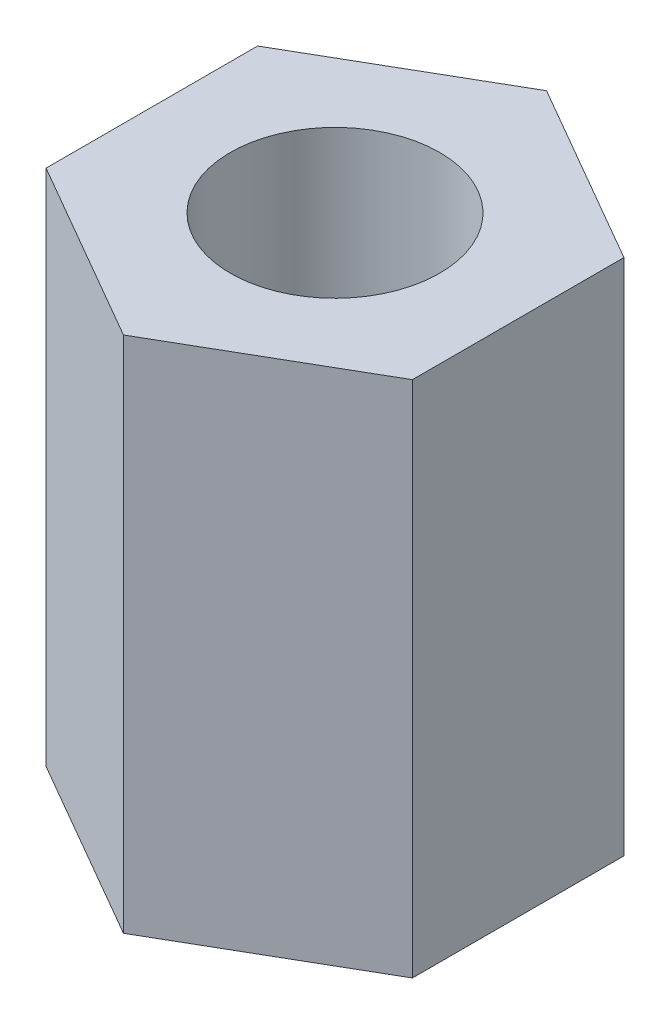
ISO-10303-21;
HEADER;
FILE_DESCRIPTION(('STEP AP214'),'2;1');
FILE_NAME('part.step','',(''),(''),'','','');
FILE_SCHEMA(('AUTOMOTIVE_DESIGN { 1 0 10303 214 1 1 1 1 }'));
ENDSEC;
DATA;
#1=APPLICATION_CONTEXT('core data for automotive mechanical design processes');
#2=APPLICATION_PROTOCOL_DEFINITION('international standard','automotive_design',2000,#1);
#3=PRODUCT_CONTEXT('',#1,'mechanical');
#4=PRODUCT('Part','Part','',(#3));
#5=PRODUCT_RELATED_PRODUCT_CATEGORY('part','',(#4));
#6=PRODUCT_DEFINITION_FORMATION('','',#4);
#7=PRODUCT_DEFINITION_CONTEXT('part definition',#1,'design');
#8=PRODUCT_DEFINITION('design','',#6,#7);
#9=PRODUCT_DEFINITION_SHAPE('','',#8);
#10=(LENGTH_UNIT() NAMED_UNIT(*) SI_UNIT(.MILLI.,.METRE.));
#11=(NAMED_UNIT(*) PLANE_ANGLE_UNIT() SI_UNIT($,.RADIAN.));
#12=(NAMED_UNIT(*) SI_UNIT($,.STERADIAN.) SOLID_ANGLE_UNIT());
#13=UNCERTAINTY_MEASURE_WITH_UNIT(LENGTH_MEASURE(1.E-05),#10,'distance_accuracy_value','');
#14=(GEOMETRIC_REPRESENTATION_CONTEXT(3) GLOBAL_UNCERTAINTY_ASSIGNED_CONTEXT((#13)) GLOBAL_UNIT_ASSIGNED_CONTEXT((#10,
#11,#12)) REPRESENTATION_CONTEXT('',''));
#15=CARTESIAN_POINT('',(0.,0.,0.));
#16=DIRECTION('',(0.,0.,1.));
#17=DIRECTION('',(1.,0.,0.));
#18=AXIS2_PLACEMENT_3D('',#15,#16,#17);
#19=CARTESIAN_POINT('',(0.,9.9,0.));
#20=DIRECTION('',(0.,1.,0.));
#21=DIRECTION('',(0.,0.,1.));
#22=AXIS2_PLACEMENT_3D('',#19,#20,#21);
#23=PLANE('',#22);
#24=DIRECTION('',(0.,0.,1.));
#25=VECTOR('',#24,1.);
#26=CARTESIAN_POINT('',(-3.5,9.9,-2.02072594216369));
#27=LINE('',#26,#25);
#28=CARTESIAN_POINT('',(-3.5,9.9,-2.02072594216369));
#29=VERTEX_POINT('',#28);
#30=CARTESIAN_POINT('',(-3.5,9.9,2.02072594216369));
#31=VERTEX_POINT('',#30);
#32=EDGE_CURVE('E152',#29,#31,#27,.T.);
#33=ORIENTED_EDGE('',*,*,#32,.T.);
#34=DIRECTION('',(0.866025403784439,0.,0.5));
#35=VECTOR('',#34,1.);
#36=CARTESIAN_POINT('',(-3.5,9.9,2.02072594216369));
#37=LINE('',#36,#35);
#38=CARTESIAN_POINT('',(0.,9.9,4.04145188432738));
#39=VERTEX_POINT('',#38);
#40=EDGE_CURVE('E100',#31,#39,#37,.T.);
#41=ORIENTED_EDGE('',*,*,#40,.T.);
#42=DIRECTION('',(0.866025403784439,0.,-0.5));
#43=VECTOR('',#42,1.);
#44=CARTESIAN_POINT('',(0.,9.9,4.04145188432738));
#45=LINE('',#44,#43);
#46=CARTESIAN_POINT('',(3.5,9.9,2.02072594216369));
#47=VERTEX_POINT('',#46);
#48=EDGE_CURVE('E113',#39,#47,#45,.T.);
#49=ORIENTED_EDGE('',*,*,#48,.T.);
#50=DIRECTION('',(0.,0.,-1.));
#51=VECTOR('',#50,1.);
#52=CARTESIAN_POINT('',(3.5,9.9,2.02072594216369));
#53=LINE('',#52,#51);
#54=CARTESIAN_POINT('',(3.5,9.9,-2.02072594216369));
#55=VERTEX_POINT('',#54);
#56=EDGE_CURVE('E107',#47,#55,#53,.T.);
#57=ORIENTED_EDGE('',*,*,#56,.T.);
#58=DIRECTION('',(-0.866025403784439,0.,-0.5));
#59=VECTOR('',#58,1.);
#60=CARTESIAN_POINT('',(3.5,9.9,-2.02072594216369));
#61=LINE('',#60,#59);
#62=CARTESIAN_POINT('',(0.,9.9,-4.04145188432738));
#63=VERTEX_POINT('',#62);
#64=EDGE_CURVE('E111',#55,#63,#61,.T.);
#65=ORIENTED_EDGE('',*,*,#64,.T.);
#66=DIRECTION('',(-0.866025403784438,0.,0.5));
#67=VECTOR('',#66,1.);
#68=CARTESIAN_POINT('',(0.,9.9,-4.04145188432738));
#69=LINE('',#68,#67);
#70=EDGE_CURVE('E63',#63,#29,#69,.T.);
#71=ORIENTED_EDGE('',*,*,#70,.T.);
#72=EDGE_LOOP('',(#33,#41,#49,#57,#65,#71));
#73=FACE_BOUND('',#72,.T.);
#74=CARTESIAN_POINT('',(0.,9.9,0.));
#75=DIRECTION('',(0.,1.,0.));
#76=DIRECTION('',(0.,0.,1.));
#77=AXIS2_PLACEMENT_3D('',#74,#75,#76);
#78=CIRCLE('',#77,2.);
#79=CARTESIAN_POINT('',(0.,9.9,-2.));
#80=VERTEX_POINT('',#79);
#81=EDGE_CURVE('E140',#80,#80,#78,.T.);
#82=ORIENTED_EDGE('',*,*,#81,.F.);
#83=EDGE_LOOP('',(#82));
#84=FACE_BOUND('',#83,.T.);
#85=ADVANCED_FACE('F45',(#73,#84),#23,.T.);
#86=CARTESIAN_POINT('',(0.,0.,0.));
#87=DIRECTION('',(0.,1.,0.));
#88=DIRECTION('',(0.,0.,1.));
#89=AXIS2_PLACEMENT_3D('',#86,#87,#88);
#90=PLANE('',#89);
#91=DIRECTION('',(0.,0.,1.));
#92=VECTOR('',#91,1.);
#93=CARTESIAN_POINT('',(-3.5,0.,-2.02072594216369));
#94=LINE('',#93,#92);
#95=CARTESIAN_POINT('',(-3.5,0.,-2.02072594216369));
#96=VERTEX_POINT('',#95);
#97=CARTESIAN_POINT('',(-3.5,0.,2.02072594216369));
#98=VERTEX_POINT('',#97);
#99=EDGE_CURVE('E135',#96,#98,#94,.T.);
#100=ORIENTED_EDGE('',*,*,#99,.F.);
#101=DIRECTION('',(-0.866025403784438,0.,0.5));
#102=VECTOR('',#101,1.);
#103=CARTESIAN_POINT('',(0.,0.,-4.04145188432738));
#104=LINE('',#103,#102);
#105=CARTESIAN_POINT('',(0.,0.,-4.04145188432738));
#106=VERTEX_POINT('',#105);
#107=EDGE_CURVE('E92',#106,#96,#104,.T.);
#108=ORIENTED_EDGE('',*,*,#107,.F.);
#109=DIRECTION('',(-0.866025403784439,0.,-0.5));
#110=VECTOR('',#109,1.);
#111=CARTESIAN_POINT('',(3.5,0.,-2.02072594216369));
#112=LINE('',#111,#110);
#113=CARTESIAN_POINT('',(3.5,0.,-2.02072594216369));
#114=VERTEX_POINT('',#113);
#115=EDGE_CURVE('E86',#114,#106,#112,.T.);
#116=ORIENTED_EDGE('',*,*,#115,.F.);
#117=DIRECTION('',(0.,0.,-1.));
#118=VECTOR('',#117,1.);
#119=CARTESIAN_POINT('',(3.5,0.,2.02072594216369));
#120=LINE('',#119,#118);
#121=CARTESIAN_POINT('',(3.5,0.,2.02072594216369));
#122=VERTEX_POINT('',#121);
#123=EDGE_CURVE('E122',#122,#114,#120,.T.);
#124=ORIENTED_EDGE('',*,*,#123,.F.);
#125=DIRECTION('',(0.866025403784439,0.,-0.5));
#126=VECTOR('',#125,1.);
#127=CARTESIAN_POINT('',(0.,0.,4.04145188432738));
#128=LINE('',#127,#126);
#129=CARTESIAN_POINT('',(0.,0.,4.04145188432738));
#130=VERTEX_POINT('',#129);
#131=EDGE_CURVE('E143',#130,#122,#128,.T.);
#132=ORIENTED_EDGE('',*,*,#131,.F.);
#133=DIRECTION('',(0.866025403784439,0.,0.5));
#134=VECTOR('',#133,1.);
#135=CARTESIAN_POINT('',(-3.5,0.,2.02072594216369));
#136=LINE('',#135,#134);
#137=EDGE_CURVE('E139',#98,#130,#136,.T.);
#138=ORIENTED_EDGE('',*,*,#137,.F.);
#139=EDGE_LOOP('',(#100,#108,#116,#124,#132,#138));
#140=FACE_BOUND('',#139,.T.);
#141=CARTESIAN_POINT('',(0.,0.,0.));
#142=DIRECTION('',(0.,1.,0.));
#143=DIRECTION('',(0.,0.,1.));
#144=AXIS2_PLACEMENT_3D('',#141,#142,#143);
#145=CIRCLE('',#144,2.);
#146=CARTESIAN_POINT('',(0.,0.,-2.));
#147=VERTEX_POINT('',#146);
#148=EDGE_CURVE('E249',#147,#147,#145,.T.);
#149=ORIENTED_EDGE('',*,*,#148,.T.);
#150=EDGE_LOOP('',(#149));
#151=FACE_BOUND('',#150,.T.);
#152=ADVANCED_FACE('F165',(#140,#151),#90,.F.);
#153=CARTESIAN_POINT('',(-3.5,9.9,-2.02072594216369));
#154=DIRECTION('',(1.,0.,0.));
#155=DIRECTION('',(0.,0.,-1.));
#156=AXIS2_PLACEMENT_3D('',#153,#154,#155);
#157=PLANE('',#156);
#158=ORIENTED_EDGE('',*,*,#99,.T.);
#159=DIRECTION('',(0.,-1.,0.));
#160=VECTOR('',#159,1.);
#161=CARTESIAN_POINT('',(-3.5,9.9,2.02072594216369));
#162=LINE('',#161,#160);
#163=EDGE_CURVE('E11',#31,#98,#162,.T.);
#164=ORIENTED_EDGE('',*,*,#163,.F.);
#165=ORIENTED_EDGE('',*,*,#32,.F.);
#166=DIRECTION('',(0.,-1.,0.));
#167=VECTOR('',#166,1.);
#168=CARTESIAN_POINT('',(-3.5,9.9,-2.02072594216369));
#169=LINE('',#168,#167);
#170=EDGE_CURVE('E131',#29,#96,#169,.T.);
#171=ORIENTED_EDGE('',*,*,#170,.T.);
#172=EDGE_LOOP('',(#158,#164,#165,#171));
#173=FACE_BOUND('',#172,.T.);
#174=ADVANCED_FACE('F47',(#173),#157,.F.);
#175=CARTESIAN_POINT('',(-3.5,9.9,2.02072594216369));
#176=DIRECTION('',(0.5,0.,-0.866025403784439));
#177=DIRECTION('',(-0.866025403784439,0.,-0.5));
#178=AXIS2_PLACEMENT_3D('',#175,#176,#177);
#179=PLANE('',#178);
#180=ORIENTED_EDGE('',*,*,#137,.T.);
#181=DIRECTION('',(0.,-1.,0.));
#182=VECTOR('',#181,1.);
#183=CARTESIAN_POINT('',(0.,9.9,4.04145188432738));
#184=LINE('',#183,#182);
#185=EDGE_CURVE('E55',#39,#130,#184,.T.);
#186=ORIENTED_EDGE('',*,*,#185,.F.);
#187=ORIENTED_EDGE('',*,*,#40,.F.);
#188=ORIENTED_EDGE('',*,*,#163,.T.);
#189=EDGE_LOOP('',(#180,#186,#187,#188));
#190=FACE_BOUND('',#189,.T.);
#191=ADVANCED_FACE('F190',(#190),#179,.F.);
#192=CARTESIAN_POINT('',(0.,9.9,4.04145188432738));
#193=DIRECTION('',(-0.5,0.,-0.866025403784439));
#194=DIRECTION('',(-0.866025403784439,0.,0.5));
#195=AXIS2_PLACEMENT_3D('',#192,#193,#194);
#196=PLANE('',#195);
#197=ORIENTED_EDGE('',*,*,#131,.T.);
#198=DIRECTION('',(0.,-1.,0.));
#199=VECTOR('',#198,1.);
#200=CARTESIAN_POINT('',(3.5,9.9,2.02072594216369));
#201=LINE('',#200,#199);
#202=EDGE_CURVE('E124',#47,#122,#201,.T.);
#203=ORIENTED_EDGE('',*,*,#202,.F.);
#204=ORIENTED_EDGE('',*,*,#48,.F.);
#205=ORIENTED_EDGE('',*,*,#185,.T.);
#206=EDGE_LOOP('',(#197,#203,#204,#205));
#207=FACE_BOUND('',#206,.T.);
#208=ADVANCED_FACE('F162',(#207),#196,.F.);
#209=CARTESIAN_POINT('',(3.5,9.9,2.02072594216369));
#210=DIRECTION('',(-1.,0.,0.));
#211=DIRECTION('',(0.,0.,1.));
#212=AXIS2_PLACEMENT_3D('',#209,#210,#211);
#213=PLANE('',#212);
#214=ORIENTED_EDGE('',*,*,#123,.T.);
#215=DIRECTION('',(0.,-1.,0.));
#216=VECTOR('',#215,1.);
#217=CARTESIAN_POINT('',(3.5,9.9,-2.02072594216369));
#218=LINE('',#217,#216);
#219=EDGE_CURVE('E119',#55,#114,#218,.T.);
#220=ORIENTED_EDGE('',*,*,#219,.F.);
#221=ORIENTED_EDGE('',*,*,#56,.F.);
#222=ORIENTED_EDGE('',*,*,#202,.T.);
#223=EDGE_LOOP('',(#214,#220,#221,#222));
#224=FACE_BOUND('',#223,.T.);
#225=ADVANCED_FACE('F120',(#224),#213,.F.);
#226=CARTESIAN_POINT('',(3.5,9.9,-2.02072594216369));
#227=DIRECTION('',(-0.5,0.,0.866025403784439));
#228=DIRECTION('',(0.866025403784439,0.,0.5));
#229=AXIS2_PLACEMENT_3D('',#226,#227,#228);
#230=PLANE('',#229);
#231=ORIENTED_EDGE('',*,*,#115,.T.);
#232=DIRECTION('',(0.,-1.,0.));
#233=VECTOR('',#232,1.);
#234=CARTESIAN_POINT('',(0.,9.9,-4.04145188432738));
#235=LINE('',#234,#233);
#236=EDGE_CURVE('E125',#63,#106,#235,.T.);
#237=ORIENTED_EDGE('',*,*,#236,.F.);
#238=ORIENTED_EDGE('',*,*,#64,.F.);
#239=ORIENTED_EDGE('',*,*,#219,.T.);
#240=EDGE_LOOP('',(#231,#237,#238,#239));
#241=FACE_BOUND('',#240,.T.);
#242=ADVANCED_FACE('F127',(#241),#230,.F.);
#243=CARTESIAN_POINT('',(0.,9.9,-4.04145188432738));
#244=DIRECTION('',(0.5,0.,0.866025403784439));
#245=DIRECTION('',(0.866025403784439,0.,-0.5));
#246=AXIS2_PLACEMENT_3D('',#243,#244,#245);
#247=PLANE('',#246);
#248=ORIENTED_EDGE('',*,*,#107,.T.);
#249=ORIENTED_EDGE('',*,*,#170,.F.);
#250=ORIENTED_EDGE('',*,*,#70,.F.);
#251=ORIENTED_EDGE('',*,*,#236,.T.);
#252=EDGE_LOOP('',(#248,#249,#250,#251));
#253=FACE_BOUND('',#252,.T.);
#254=ADVANCED_FACE('F170',(#253),#247,.F.);
#255=CARTESIAN_POINT('',(0.,9.9,0.));
#256=DIRECTION('',(0.,-1.,0.));
#257=DIRECTION('',(0.,0.,-1.));
#258=AXIS2_PLACEMENT_3D('',#255,#256,#257);
#259=CYLINDRICAL_SURFACE('',#258,2.);
#260=CARTESIAN_POINT('',(0.,9.9,-2.));
#261=CARTESIAN_POINT('',(0.,9.796875,-2.));
#262=CARTESIAN_POINT('',(0.,9.69375,-2.));
#263=CARTESIAN_POINT('',(0.,9.4875,-2.));
#264=CARTESIAN_POINT('',(0.,9.384375,-2.));
#265=CARTESIAN_POINT('',(0.,9.178125,-2.));
#266=CARTESIAN_POINT('',(0.,9.075,-2.));
#267=CARTESIAN_POINT('',(0.,8.86875,-2.));
#268=CARTESIAN_POINT('',(0.,8.765625,-2.));
#269=CARTESIAN_POINT('',(0.,8.559375,-2.));
#270=CARTESIAN_POINT('',(0.,8.45625,-2.));
#271=CARTESIAN_POINT('',(0.,8.25,-2.));
#272=CARTESIAN_POINT('',(0.,8.146875,-2.));
#273=CARTESIAN_POINT('',(0.,7.940625,-2.));
#274=CARTESIAN_POINT('',(0.,7.8375,-2.));
#275=CARTESIAN_POINT('',(0.,7.63125,-2.));
#276=CARTESIAN_POINT('',(0.,7.528125,-2.));
#277=CARTESIAN_POINT('',(0.,7.321875,-2.));
#278=CARTESIAN_POINT('',(0.,7.21875,-2.));
#279=CARTESIAN_POINT('',(0.,7.0125,-2.));
#280=CARTESIAN_POINT('',(0.,6.909375,-2.));
#281=CARTESIAN_POINT('',(0.,6.703125,-2.));
#282=CARTESIAN_POINT('',(0.,6.6,-2.));
#283=CARTESIAN_POINT('',(0.,6.39375,-2.));
#284=CARTESIAN_POINT('',(0.,6.290625,-2.));
#285=CARTESIAN_POINT('',(0.,6.084375,-2.));
#286=CARTESIAN_POINT('',(0.,5.98125,-2.));
#287=CARTESIAN_POINT('',(0.,5.775,-2.));
#288=CARTESIAN_POINT('',(0.,5.671875,-2.));
#289=CARTESIAN_POINT('',(0.,5.465625,-2.));
#290=CARTESIAN_POINT('',(0.,5.3625,-2.));
#291=CARTESIAN_POINT('',(0.,5.15625,-2.));
#292=CARTESIAN_POINT('',(0.,5.053125,-2.));
#293=CARTESIAN_POINT('',(0.,4.846875,-2.));
#294=CARTESIAN_POINT('',(0.,4.74375,-2.));
#295=CARTESIAN_POINT('',(0.,4.5375,-2.));
#296=CARTESIAN_POINT('',(0.,4.434375,-2.));
#297=CARTESIAN_POINT('',(0.,4.228125,-2.));
#298=CARTESIAN_POINT('',(0.,4.125,-2.));
#299=CARTESIAN_POINT('',(0.,3.91875,-2.));
#300=CARTESIAN_POINT('',(0.,3.815625,-2.));
#301=CARTESIAN_POINT('',(0.,3.609375,-2.));
#302=CARTESIAN_POINT('',(0.,3.50625,-2.));
#303=CARTESIAN_POINT('',(0.,3.3,-2.));
#304=CARTESIAN_POINT('',(0.,3.196875,-2.));
#305=CARTESIAN_POINT('',(0.,2.990625,-2.));
#306=CARTESIAN_POINT('',(0.,2.8875,-2.));
#307=CARTESIAN_POINT('',(0.,2.68125,-2.));
#308=CARTESIAN_POINT('',(0.,2.578125,-2.));
#309=CARTESIAN_POINT('',(0.,2.371875,-2.));
#310=CARTESIAN_POINT('',(0.,2.26875,-2.));
#311=CARTESIAN_POINT('',(0.,2.0625,-2.));
#312=CARTESIAN_POINT('',(0.,1.959375,-2.));
#313=CARTESIAN_POINT('',(0.,1.753125,-2.));
#314=CARTESIAN_POINT('',(0.,1.65,-2.));
#315=CARTESIAN_POINT('',(0.,1.44375,-2.));
#316=CARTESIAN_POINT('',(0.,1.340625,-2.));
#317=CARTESIAN_POINT('',(0.,1.134375,-2.));
#318=CARTESIAN_POINT('',(0.,1.03125,-2.));
#319=CARTESIAN_POINT('',(0.,0.825,-2.));
#320=CARTESIAN_POINT('',(0.,0.721875,-2.));
#321=CARTESIAN_POINT('',(0.,0.515625,-2.));
#322=CARTESIAN_POINT('',(0.,0.4125,-2.));
#323=CARTESIAN_POINT('',(0.,0.20625,-2.));
#324=CARTESIAN_POINT('',(0.,0.103125,-2.));
#325=CARTESIAN_POINT('',(0.,0.,-2.));
#326=B_SPLINE_CURVE_WITH_KNOTS('',3,(#260,#261,#262,#263,#264,#265,#266,#267,#268,#269,#270,
#271,#272,#273,#274,#275,#276,#277,#278,#279,#280,#281,#282,#283,#284,#285,#286,#287,#288,#289,
#290,#291,#292,#293,#294,#295,#296,#297,#298,#299,#300,#301,#302,#303,#304,#305,#306,#307,#308,
#309,#310,#311,#312,#313,#314,#315,#316,#317,#318,#319,#320,#321,#322,#323,#324,#325),
.UNSPECIFIED.,.F.,.F.,(4,2,2,2,2,2,2,2,2,2,2,2,2,2,2,2,2,2,2,2,2,2,2,2,2,2,2,2,2,2,2,2,4),(0.,
0.309374999999999,0.618749999999999,0.928124999999998,1.2375,1.546875,1.85625,2.165625,2.475,
2.784375,3.09375,3.403125,3.7125,4.021875,4.33125,4.640625,4.95,5.259375,5.56875,5.878125,
6.1875,6.496875,6.80625,7.115625,7.425,7.734375,8.04375,8.353125,8.6625,8.971875,9.28125,
9.590625,9.9),.UNSPECIFIED.);
#327=EDGE_CURVE('BSEAM172',#80,#147,#326,.T.);
#328=ORIENTED_EDGE('',*,*,#81,.T.);
#329=ORIENTED_EDGE('',*,*,#148,.F.);
#330=ORIENTED_EDGE('',*,*,#327,.T.);
#331=ORIENTED_EDGE('',*,*,#327,.F.);
#332=EDGE_LOOP('',(#328,#330,#329,#331));
#333=FACE_BOUND('',#332,.T.);
#334=ADVANCED_FACE('F172',(#333),#259,.F.);
#335=CLOSED_SHELL('',(#85,#152,#174,#191,#208,#225,#242,#254,#334));
#336=MANIFOLD_SOLID_BREP('B2',#335);
#337=ADVANCED_BREP_SHAPE_REPRESENTATION('',(#18,#336),#14);
#338=SHAPE_DEFINITION_REPRESENTATION(#9,#337);
ENDSEC;
END-ISO-10303-21;
